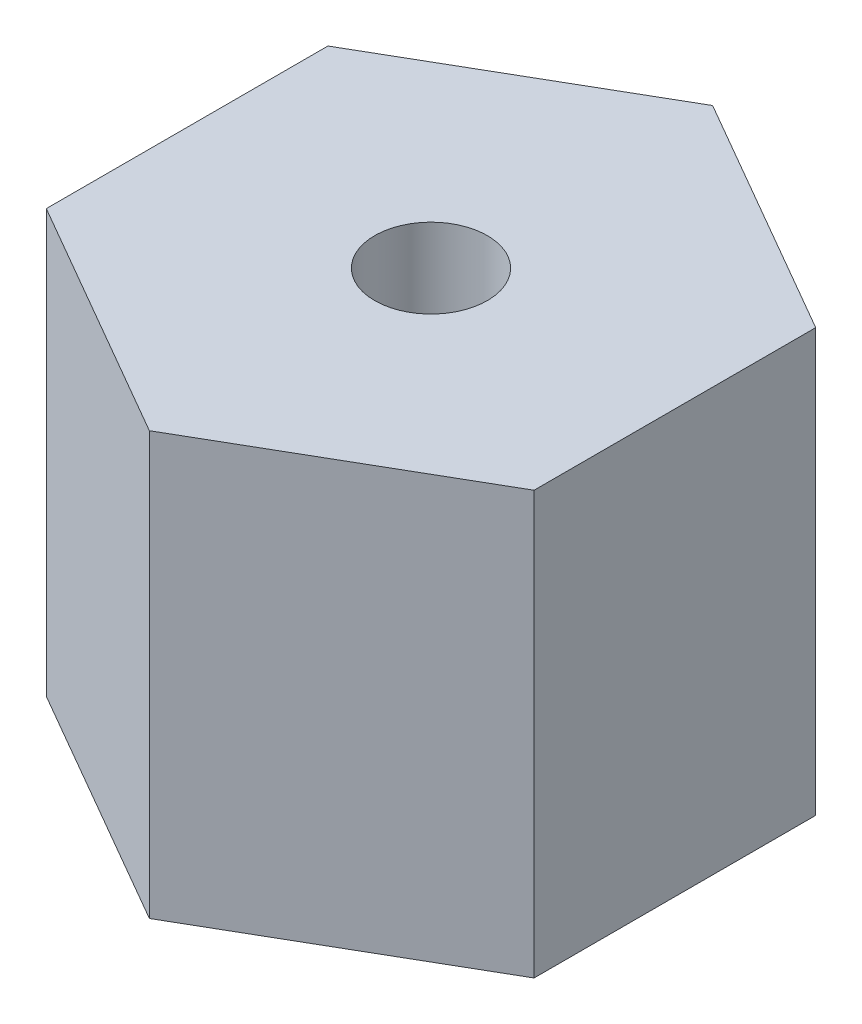
ISO-10303-21;
HEADER;
FILE_DESCRIPTION(('STEP AP214'),'2;1');
FILE_NAME('part.step','',(''),(''),'','','');
FILE_SCHEMA(('AUTOMOTIVE_DESIGN { 1 0 10303 214 1 1 1 1 }'));
ENDSEC;
DATA;
#1=APPLICATION_CONTEXT('core data for automotive mechanical design processes');
#2=APPLICATION_PROTOCOL_DEFINITION('international standard','automotive_design',2000,#1);
#3=PRODUCT_CONTEXT('',#1,'mechanical');
#4=PRODUCT('Part','Part','',(#3));
#5=PRODUCT_RELATED_PRODUCT_CATEGORY('part','',(#4));
#6=PRODUCT_DEFINITION_FORMATION('','',#4);
#7=PRODUCT_DEFINITION_CONTEXT('part definition',#1,'design');
#8=PRODUCT_DEFINITION('design','',#6,#7);
#9=PRODUCT_DEFINITION_SHAPE('','',#8);
#10=(LENGTH_UNIT() NAMED_UNIT(*) SI_UNIT(.MILLI.,.METRE.));
#11=(NAMED_UNIT(*) PLANE_ANGLE_UNIT() SI_UNIT($,.RADIAN.));
#12=(NAMED_UNIT(*) SI_UNIT($,.STERADIAN.) SOLID_ANGLE_UNIT());
#13=UNCERTAINTY_MEASURE_WITH_UNIT(LENGTH_MEASURE(1.E-05),#10,'distance_accuracy_value','');
#14=(GEOMETRIC_REPRESENTATION_CONTEXT(3) GLOBAL_UNCERTAINTY_ASSIGNED_CONTEXT((#13)) GLOBAL_UNIT_ASSIGNED_CONTEXT((#10,
#11,#12)) REPRESENTATION_CONTEXT('',''));
#15=CARTESIAN_POINT('',(0.,0.,0.));
#16=DIRECTION('',(0.,0.,1.));
#17=DIRECTION('',(1.,0.,0.));
#18=AXIS2_PLACEMENT_3D('',#15,#16,#17);
#19=CARTESIAN_POINT('',(8.66025403784439,15.,0.));
#20=DIRECTION('',(-1.,0.,0.));
#21=DIRECTION('',(0.,0.,1.));
#22=AXIS2_PLACEMENT_3D('',#19,#20,#21);
#23=PLANE('',#22);
#24=DIRECTION('',(0.,0.,-1.));
#25=VECTOR('',#24,1.);
#26=CARTESIAN_POINT('',(8.66025403784439,0.,0.));
#27=LINE('',#26,#25);
#28=CARTESIAN_POINT('',(8.66025403784439,0.,5.));
#29=VERTEX_POINT('',#28);
#30=CARTESIAN_POINT('',(8.66025403784438,0.,-5.00000000000001));
#31=VERTEX_POINT('',#30);
#32=EDGE_CURVE('E131',#29,#31,#27,.T.);
#33=ORIENTED_EDGE('',*,*,#32,.T.);
#34=DIRECTION('',(0.,-1.,0.));
#35=VECTOR('',#34,1.);
#36=CARTESIAN_POINT('',(8.66025403784438,15.,-5.00000000000001));
#37=LINE('',#36,#35);
#38=CARTESIAN_POINT('',(8.66025403784438,15.,-5.00000000000001));
#39=VERTEX_POINT('',#38);
#40=EDGE_CURVE('E11',#39,#31,#37,.T.);
#41=ORIENTED_EDGE('',*,*,#40,.F.);
#42=DIRECTION('',(0.,0.,-1.));
#43=VECTOR('',#42,1.);
#44=CARTESIAN_POINT('',(8.66025403784439,15.,0.));
#45=LINE('',#44,#43);
#46=CARTESIAN_POINT('',(8.66025403784439,15.,5.));
#47=VERTEX_POINT('',#46);
#48=EDGE_CURVE('E165',#47,#39,#45,.T.);
#49=ORIENTED_EDGE('',*,*,#48,.F.);
#50=DIRECTION('',(0.,-1.,0.));
#51=VECTOR('',#50,1.);
#52=CARTESIAN_POINT('',(8.66025403784439,15.,5.));
#53=LINE('',#52,#51);
#54=EDGE_CURVE('E127',#47,#29,#53,.T.);
#55=ORIENTED_EDGE('',*,*,#54,.T.);
#56=EDGE_LOOP('',(#33,#41,#49,#55));
#57=FACE_BOUND('',#56,.T.);
#58=ADVANCED_FACE('F41',(#57),#23,.F.);
#59=CARTESIAN_POINT('',(4.33012701892219,15.,-7.5));
#60=DIRECTION('',(-0.5,0.,0.866025403784439));
#61=DIRECTION('',(0.866025403784439,0.,0.5));
#62=AXIS2_PLACEMENT_3D('',#59,#60,#61);
#63=PLANE('',#62);
#64=DIRECTION('',(-0.866025403784439,0.,-0.5));
#65=VECTOR('',#64,1.);
#66=CARTESIAN_POINT('',(4.33012701892219,0.,-7.5));
#67=LINE('',#66,#65);
#68=CARTESIAN_POINT('',(0.,0.,-10.));
#69=VERTEX_POINT('',#68);
#70=EDGE_CURVE('E135',#31,#69,#67,.T.);
#71=ORIENTED_EDGE('',*,*,#70,.T.);
#72=DIRECTION('',(0.,-1.,0.));
#73=VECTOR('',#72,1.);
#74=CARTESIAN_POINT('',(0.,15.,-10.));
#75=LINE('',#74,#73);
#76=CARTESIAN_POINT('',(0.,15.,-10.));
#77=VERTEX_POINT('',#76);
#78=EDGE_CURVE('E51',#77,#69,#75,.T.);
#79=ORIENTED_EDGE('',*,*,#78,.F.);
#80=DIRECTION('',(-0.866025403784439,0.,-0.5));
#81=VECTOR('',#80,1.);
#82=CARTESIAN_POINT('',(4.33012701892219,15.,-7.5));
#83=LINE('',#82,#81);
#84=EDGE_CURVE('E96',#39,#77,#83,.T.);
#85=ORIENTED_EDGE('',*,*,#84,.F.);
#86=ORIENTED_EDGE('',*,*,#40,.T.);
#87=EDGE_LOOP('',(#71,#79,#85,#86));
#88=FACE_BOUND('',#87,.T.);
#89=ADVANCED_FACE('F179',(#88),#63,.F.);
#90=CARTESIAN_POINT('',(-4.33012701892219,15.,-7.5));
#91=DIRECTION('',(0.5,0.,0.866025403784439));
#92=DIRECTION('',(0.866025403784439,0.,-0.5));
#93=AXIS2_PLACEMENT_3D('',#90,#91,#92);
#94=PLANE('',#93);
#95=DIRECTION('',(-0.866025403784439,0.,0.5));
#96=VECTOR('',#95,1.);
#97=CARTESIAN_POINT('',(-4.33012701892219,0.,-7.5));
#98=LINE('',#97,#96);
#99=CARTESIAN_POINT('',(-8.66025403784439,0.,-5.));
#100=VERTEX_POINT('',#99);
#101=EDGE_CURVE('E139',#69,#100,#98,.T.);
#102=ORIENTED_EDGE('',*,*,#101,.T.);
#103=DIRECTION('',(0.,-1.,0.));
#104=VECTOR('',#103,1.);
#105=CARTESIAN_POINT('',(-8.66025403784439,15.,-5.));
#106=LINE('',#105,#104);
#107=CARTESIAN_POINT('',(-8.66025403784439,15.,-5.));
#108=VERTEX_POINT('',#107);
#109=EDGE_CURVE('E120',#108,#100,#106,.T.);
#110=ORIENTED_EDGE('',*,*,#109,.F.);
#111=DIRECTION('',(-0.866025403784439,0.,0.5));
#112=VECTOR('',#111,1.);
#113=CARTESIAN_POINT('',(-4.33012701892219,15.,-7.5));
#114=LINE('',#113,#112);
#115=EDGE_CURVE('E109',#77,#108,#114,.T.);
#116=ORIENTED_EDGE('',*,*,#115,.F.);
#117=ORIENTED_EDGE('',*,*,#78,.T.);
#118=EDGE_LOOP('',(#102,#110,#116,#117));
#119=FACE_BOUND('',#118,.T.);
#120=ADVANCED_FACE('F158',(#119),#94,.F.);
#121=CARTESIAN_POINT('',(-8.66025403784439,15.,0.));
#122=DIRECTION('',(1.,0.,0.));
#123=DIRECTION('',(0.,0.,-1.));
#124=AXIS2_PLACEMENT_3D('',#121,#122,#123);
#125=PLANE('',#124);
#126=DIRECTION('',(0.,0.,1.));
#127=VECTOR('',#126,1.);
#128=CARTESIAN_POINT('',(-8.66025403784439,0.,0.));
#129=LINE('',#128,#127);
#130=CARTESIAN_POINT('',(-8.66025403784438,0.,5.));
#131=VERTEX_POINT('',#130);
#132=EDGE_CURVE('E118',#100,#131,#129,.T.);
#133=ORIENTED_EDGE('',*,*,#132,.T.);
#134=DIRECTION('',(0.,-1.,0.));
#135=VECTOR('',#134,1.);
#136=CARTESIAN_POINT('',(-8.66025403784438,15.,5.));
#137=LINE('',#136,#135);
#138=CARTESIAN_POINT('',(-8.66025403784438,15.,5.));
#139=VERTEX_POINT('',#138);
#140=EDGE_CURVE('E115',#139,#131,#137,.T.);
#141=ORIENTED_EDGE('',*,*,#140,.F.);
#142=DIRECTION('',(0.,0.,1.));
#143=VECTOR('',#142,1.);
#144=CARTESIAN_POINT('',(-8.66025403784439,15.,0.));
#145=LINE('',#144,#143);
#146=EDGE_CURVE('E103',#108,#139,#145,.T.);
#147=ORIENTED_EDGE('',*,*,#146,.F.);
#148=ORIENTED_EDGE('',*,*,#109,.T.);
#149=EDGE_LOOP('',(#133,#141,#147,#148));
#150=FACE_BOUND('',#149,.T.);
#151=ADVANCED_FACE('F116',(#150),#125,.F.);
#152=CARTESIAN_POINT('',(-4.33012701892219,15.,7.5));
#153=DIRECTION('',(0.5,0.,-0.866025403784439));
#154=DIRECTION('',(-0.866025403784439,0.,-0.5));
#155=AXIS2_PLACEMENT_3D('',#152,#153,#154);
#156=PLANE('',#155);
#157=DIRECTION('',(0.866025403784439,0.,0.5));
#158=VECTOR('',#157,1.);
#159=CARTESIAN_POINT('',(-4.33012701892219,0.,7.5));
#160=LINE('',#159,#158);
#161=CARTESIAN_POINT('',(0.,0.,10.));
#162=VERTEX_POINT('',#161);
#163=EDGE_CURVE('E82',#131,#162,#160,.T.);
#164=ORIENTED_EDGE('',*,*,#163,.T.);
#165=DIRECTION('',(0.,-1.,0.));
#166=VECTOR('',#165,1.);
#167=CARTESIAN_POINT('',(0.,15.,10.));
#168=LINE('',#167,#166);
#169=CARTESIAN_POINT('',(0.,15.,10.));
#170=VERTEX_POINT('',#169);
#171=EDGE_CURVE('E121',#170,#162,#168,.T.);
#172=ORIENTED_EDGE('',*,*,#171,.F.);
#173=DIRECTION('',(0.866025403784439,0.,0.5));
#174=VECTOR('',#173,1.);
#175=CARTESIAN_POINT('',(-4.33012701892219,15.,7.5));
#176=LINE('',#175,#174);
#177=EDGE_CURVE('E107',#139,#170,#176,.T.);
#178=ORIENTED_EDGE('',*,*,#177,.F.);
#179=ORIENTED_EDGE('',*,*,#140,.T.);
#180=EDGE_LOOP('',(#164,#172,#178,#179));
#181=FACE_BOUND('',#180,.T.);
#182=ADVANCED_FACE('F123',(#181),#156,.F.);
#183=CARTESIAN_POINT('',(0.,15.,0.));
#184=DIRECTION('',(0.,-1.,0.));
#185=DIRECTION('',(0.,0.,-1.));
#186=AXIS2_PLACEMENT_3D('',#183,#184,#185);
#187=CYLINDRICAL_SURFACE('',#186,2.);
#188=CARTESIAN_POINT('',(0.,9.,0.));
#189=DIRECTION('',(0.,1.,0.));
#190=DIRECTION('',(0.,0.,1.));
#191=AXIS2_PLACEMENT_3D('',#188,#189,#190);
#192=CIRCLE('',#191,2.);
#193=CARTESIAN_POINT('',(0.,9.,2.));
#194=VERTEX_POINT('',#193);
#195=EDGE_CURVE('E237',#194,#194,#192,.T.);
#196=ORIENTED_EDGE('',*,*,#195,.F.);
#197=EDGE_LOOP('',(#196));
#198=FACE_BOUND('',#197,.T.);
#199=CARTESIAN_POINT('',(0.,15.,0.));
#200=DIRECTION('',(0.,1.,0.));
#201=DIRECTION('',(0.,0.,1.));
#202=AXIS2_PLACEMENT_3D('',#199,#200,#201);
#203=CIRCLE('',#202,2.);
#204=CARTESIAN_POINT('',(0.,15.,2.));
#205=VERTEX_POINT('',#204);
#206=EDGE_CURVE('E148',#205,#205,#203,.T.);
#207=ORIENTED_EDGE('',*,*,#206,.T.);
#208=EDGE_LOOP('',(#207));
#209=FACE_BOUND('',#208,.T.);
#210=ADVANCED_FACE('F43',(#198,#209),#187,.F.);
#211=CARTESIAN_POINT('',(4.33012701892219,15.,7.5));
#212=DIRECTION('',(-0.5,0.,-0.866025403784439));
#213=DIRECTION('',(-0.866025403784439,0.,0.5));
#214=AXIS2_PLACEMENT_3D('',#211,#212,#213);
#215=PLANE('',#214);
#216=DIRECTION('',(0.866025403784439,0.,-0.5));
#217=VECTOR('',#216,1.);
#218=CARTESIAN_POINT('',(4.33012701892219,0.,7.5));
#219=LINE('',#218,#217);
#220=EDGE_CURVE('E88',#162,#29,#219,.T.);
#221=ORIENTED_EDGE('',*,*,#220,.T.);
#222=ORIENTED_EDGE('',*,*,#54,.F.);
#223=DIRECTION('',(0.866025403784439,0.,-0.5));
#224=VECTOR('',#223,1.);
#225=CARTESIAN_POINT('',(4.33012701892219,15.,7.5));
#226=LINE('',#225,#224);
#227=EDGE_CURVE('E59',#170,#47,#226,.T.);
#228=ORIENTED_EDGE('',*,*,#227,.F.);
#229=ORIENTED_EDGE('',*,*,#171,.T.);
#230=EDGE_LOOP('',(#221,#222,#228,#229));
#231=FACE_BOUND('',#230,.T.);
#232=ADVANCED_FACE('F166',(#231),#215,.F.);
#233=CARTESIAN_POINT('',(0.,15.,0.));
#234=DIRECTION('',(0.,1.,0.));
#235=DIRECTION('',(0.,0.,1.));
#236=AXIS2_PLACEMENT_3D('',#233,#234,#235);
#237=PLANE('',#236);
#238=ORIENTED_EDGE('',*,*,#206,.F.);
#239=EDGE_LOOP('',(#238));
#240=FACE_BOUND('',#239,.T.);
#241=ORIENTED_EDGE('',*,*,#48,.T.);
#242=ORIENTED_EDGE('',*,*,#84,.T.);
#243=ORIENTED_EDGE('',*,*,#115,.T.);
#244=ORIENTED_EDGE('',*,*,#146,.T.);
#245=ORIENTED_EDGE('',*,*,#177,.T.);
#246=ORIENTED_EDGE('',*,*,#227,.T.);
#247=EDGE_LOOP('',(#241,#242,#243,#244,#245,#246));
#248=FACE_BOUND('',#247,.T.);
#249=ADVANCED_FACE('F105',(#240,#248),#237,.T.);
#250=CARTESIAN_POINT('',(0.,0.,0.));
#251=DIRECTION('',(0.,1.,0.));
#252=DIRECTION('',(0.,0.,1.));
#253=AXIS2_PLACEMENT_3D('',#250,#251,#252);
#254=PLANE('',#253);
#255=CARTESIAN_POINT('',(0.,0.,0.));
#256=DIRECTION('',(0.,1.,0.));
#257=DIRECTION('',(0.,0.,1.));
#258=AXIS2_PLACEMENT_3D('',#255,#256,#257);
#259=CIRCLE('',#258,3.);
#260=CARTESIAN_POINT('',(0.,0.,3.));
#261=VERTEX_POINT('',#260);
#262=EDGE_CURVE('E243',#261,#261,#259,.T.);
#263=ORIENTED_EDGE('',*,*,#262,.T.);
#264=EDGE_LOOP('',(#263));
#265=FACE_BOUND('',#264,.T.);
#266=ORIENTED_EDGE('',*,*,#32,.F.);
#267=ORIENTED_EDGE('',*,*,#220,.F.);
#268=ORIENTED_EDGE('',*,*,#163,.F.);
#269=ORIENTED_EDGE('',*,*,#132,.F.);
#270=ORIENTED_EDGE('',*,*,#101,.F.);
#271=ORIENTED_EDGE('',*,*,#70,.F.);
#272=EDGE_LOOP('',(#266,#267,#268,#269,#270,#271));
#273=FACE_BOUND('',#272,.T.);
#274=ADVANCED_FACE('F161',(#265,#273),#254,.F.);
#275=CARTESIAN_POINT('',(0.,9.,0.));
#276=DIRECTION('',(0.,-1.,0.));
#277=DIRECTION('',(0.,0.,-1.));
#278=AXIS2_PLACEMENT_3D('',#275,#276,#277);
#279=CYLINDRICAL_SURFACE('',#278,3.);
#280=CARTESIAN_POINT('',(0.,9.,0.));
#281=DIRECTION('',(0.,1.,0.));
#282=DIRECTION('',(0.,0.,1.));
#283=AXIS2_PLACEMENT_3D('',#280,#281,#282);
#284=CIRCLE('',#283,3.);
#285=CARTESIAN_POINT('',(0.,9.,3.));
#286=VERTEX_POINT('',#285);
#287=EDGE_CURVE('E136',#286,#286,#284,.T.);
#288=ORIENTED_EDGE('',*,*,#287,.T.);
#289=EDGE_LOOP('',(#288));
#290=FACE_BOUND('',#289,.T.);
#291=ORIENTED_EDGE('',*,*,#262,.F.);
#292=EDGE_LOOP('',(#291));
#293=FACE_BOUND('',#292,.T.);
#294=ADVANCED_FACE('F210',(#290,#293),#279,.F.);
#295=CARTESIAN_POINT('',(0.,9.,0.));
#296=DIRECTION('',(0.,1.,0.));
#297=DIRECTION('',(0.,0.,1.));
#298=AXIS2_PLACEMENT_3D('',#295,#296,#297);
#299=PLANE('',#298);
#300=ORIENTED_EDGE('',*,*,#195,.T.);
#301=EDGE_LOOP('',(#300));
#302=FACE_BOUND('',#301,.T.);
#303=ORIENTED_EDGE('',*,*,#287,.F.);
#304=EDGE_LOOP('',(#303));
#305=FACE_BOUND('',#304,.T.);
#306=ADVANCED_FACE('F220',(#302,#305),#299,.F.);
#307=CLOSED_SHELL('',(#58,#89,#120,#151,#182,#210,#232,#249,#274,#294,#306));
#308=MANIFOLD_SOLID_BREP('B2',#307);
#309=ADVANCED_BREP_SHAPE_REPRESENTATION('',(#18,#308),#14);
#310=SHAPE_DEFINITION_REPRESENTATION(#9,#309);
ENDSEC;
END-ISO-10303-21;
